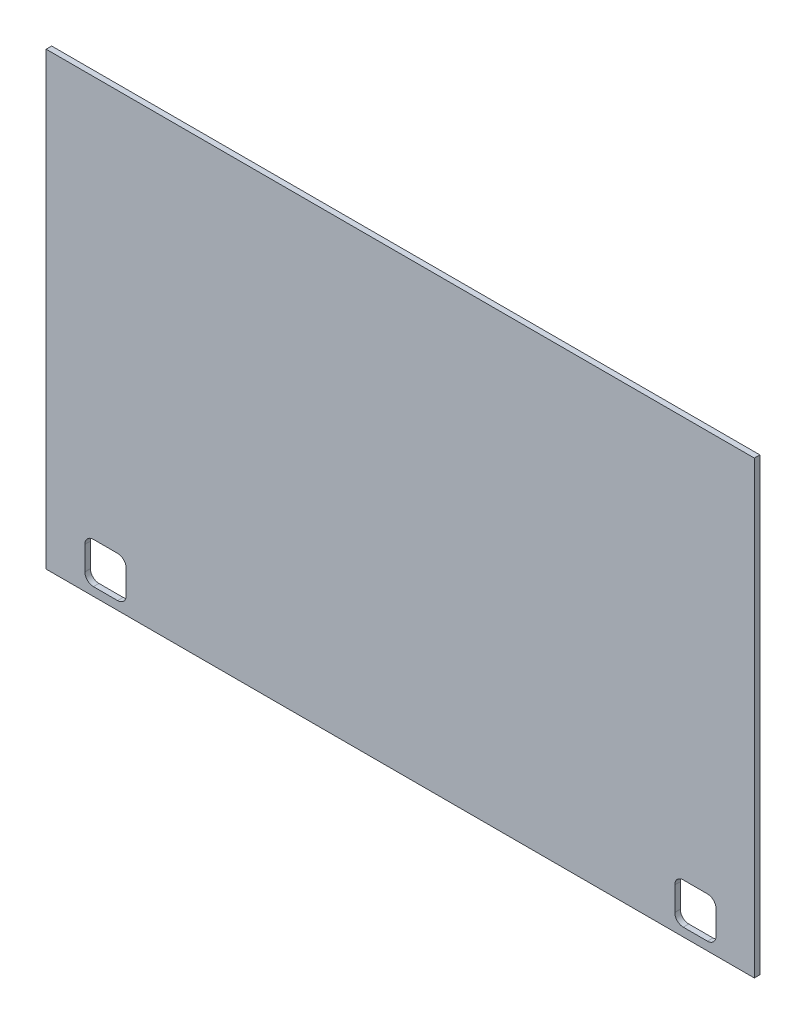
ISO-10303-21;
HEADER;
FILE_DESCRIPTION(('STEP AP214'),'2;1');
FILE_NAME('part.step','',(''),(''),'','','');
FILE_SCHEMA(('AUTOMOTIVE_DESIGN { 1 0 10303 214 1 1 1 1 }'));
ENDSEC;
DATA;
#1=APPLICATION_CONTEXT('core data for automotive mechanical design processes');
#2=APPLICATION_PROTOCOL_DEFINITION('international standard','automotive_design',2000,#1);
#3=PRODUCT_CONTEXT('',#1,'mechanical');
#4=PRODUCT('Part','Part','',(#3));
#5=PRODUCT_RELATED_PRODUCT_CATEGORY('part','',(#4));
#6=PRODUCT_DEFINITION_FORMATION('','',#4);
#7=PRODUCT_DEFINITION_CONTEXT('part definition',#1,'design');
#8=PRODUCT_DEFINITION('design','',#6,#7);
#9=PRODUCT_DEFINITION_SHAPE('','',#8);
#10=(LENGTH_UNIT() NAMED_UNIT(*) SI_UNIT(.MILLI.,.METRE.));
#11=(NAMED_UNIT(*) PLANE_ANGLE_UNIT() SI_UNIT($,.RADIAN.));
#12=(NAMED_UNIT(*) SI_UNIT($,.STERADIAN.) SOLID_ANGLE_UNIT());
#13=UNCERTAINTY_MEASURE_WITH_UNIT(LENGTH_MEASURE(1.E-05),#10,'distance_accuracy_value','');
#14=(GEOMETRIC_REPRESENTATION_CONTEXT(3) GLOBAL_UNCERTAINTY_ASSIGNED_CONTEXT((#13)) GLOBAL_UNIT_ASSIGNED_CONTEXT((#10,
#11,#12)) REPRESENTATION_CONTEXT('',''));
#15=CARTESIAN_POINT('',(0.,0.,0.));
#16=DIRECTION('',(0.,0.,1.));
#17=DIRECTION('',(1.,0.,0.));
#18=AXIS2_PLACEMENT_3D('',#15,#16,#17);
#19=CARTESIAN_POINT('',(416.,-264.5,6.5));
#20=DIRECTION('',(-1.,0.,0.));
#21=DIRECTION('',(0.,0.,1.));
#22=AXIS2_PLACEMENT_3D('',#19,#20,#21);
#23=PLANE('',#22);
#24=DIRECTION('',(0.,1.,0.));
#25=VECTOR('',#24,1.);
#26=CARTESIAN_POINT('',(416.,-264.5,0.));
#27=LINE('',#26,#25);
#28=CARTESIAN_POINT('',(416.,-264.5,0.));
#29=VERTEX_POINT('',#28);
#30=CARTESIAN_POINT('',(416.,264.5,0.));
#31=VERTEX_POINT('',#30);
#32=EDGE_CURVE('E286',#29,#31,#27,.T.);
#33=ORIENTED_EDGE('',*,*,#32,.T.);
#34=DIRECTION('',(0.,0.,-1.));
#35=VECTOR('',#34,1.);
#36=CARTESIAN_POINT('',(416.,264.5,6.5));
#37=LINE('',#36,#35);
#38=CARTESIAN_POINT('',(416.,264.5,6.5));
#39=VERTEX_POINT('',#38);
#40=EDGE_CURVE('E11',#39,#31,#37,.T.);
#41=ORIENTED_EDGE('',*,*,#40,.F.);
#42=DIRECTION('',(0.,1.,0.));
#43=VECTOR('',#42,1.);
#44=CARTESIAN_POINT('',(416.,-264.5,6.5));
#45=LINE('',#44,#43);
#46=CARTESIAN_POINT('',(416.,-264.5,6.5));
#47=VERTEX_POINT('',#46);
#48=EDGE_CURVE('E301',#47,#39,#45,.T.);
#49=ORIENTED_EDGE('',*,*,#48,.F.);
#50=DIRECTION('',(0.,0.,-1.));
#51=VECTOR('',#50,1.);
#52=CARTESIAN_POINT('',(416.,-264.5,6.5));
#53=LINE('',#52,#51);
#54=EDGE_CURVE('E311',#47,#29,#53,.T.);
#55=ORIENTED_EDGE('',*,*,#54,.T.);
#56=EDGE_LOOP('',(#33,#41,#49,#55));
#57=FACE_BOUND('',#56,.T.);
#58=ADVANCED_FACE('F32',(#57),#23,.F.);
#59=CARTESIAN_POINT('',(-416.,264.5,6.5));
#60=DIRECTION('',(0.,-1.,0.));
#61=DIRECTION('',(0.,0.,-1.));
#62=AXIS2_PLACEMENT_3D('',#59,#60,#61);
#63=PLANE('',#62);
#64=DIRECTION('',(-1.,0.,0.));
#65=VECTOR('',#64,1.);
#66=CARTESIAN_POINT('',(-416.,264.5,0.));
#67=LINE('',#66,#65);
#68=CARTESIAN_POINT('',(-416.,264.5,0.));
#69=VERTEX_POINT('',#68);
#70=EDGE_CURVE('E314',#31,#69,#67,.T.);
#71=ORIENTED_EDGE('',*,*,#70,.T.);
#72=DIRECTION('',(0.,0.,-1.));
#73=VECTOR('',#72,1.);
#74=CARTESIAN_POINT('',(-416.,264.5,6.5));
#75=LINE('',#74,#73);
#76=CARTESIAN_POINT('',(-416.,264.5,6.5));
#77=VERTEX_POINT('',#76);
#78=EDGE_CURVE('E39',#77,#69,#75,.T.);
#79=ORIENTED_EDGE('',*,*,#78,.F.);
#80=DIRECTION('',(-1.,0.,0.));
#81=VECTOR('',#80,1.);
#82=CARTESIAN_POINT('',(-416.,264.5,6.5));
#83=LINE('',#82,#81);
#84=EDGE_CURVE('E304',#39,#77,#83,.T.);
#85=ORIENTED_EDGE('',*,*,#84,.F.);
#86=ORIENTED_EDGE('',*,*,#40,.T.);
#87=EDGE_LOOP('',(#71,#79,#85,#86));
#88=FACE_BOUND('',#87,.T.);
#89=ADVANCED_FACE('F343',(#88),#63,.F.);
#90=CARTESIAN_POINT('',(-416.,-264.5,6.5));
#91=DIRECTION('',(1.,0.,0.));
#92=DIRECTION('',(0.,0.,-1.));
#93=AXIS2_PLACEMENT_3D('',#90,#91,#92);
#94=PLANE('',#93);
#95=DIRECTION('',(0.,-1.,0.));
#96=VECTOR('',#95,1.);
#97=CARTESIAN_POINT('',(-416.,-264.5,0.));
#98=LINE('',#97,#96);
#99=CARTESIAN_POINT('',(-416.,-264.5,0.));
#100=VERTEX_POINT('',#99);
#101=EDGE_CURVE('E316',#69,#100,#98,.T.);
#102=ORIENTED_EDGE('',*,*,#101,.T.);
#103=DIRECTION('',(0.,0.,-1.));
#104=VECTOR('',#103,1.);
#105=CARTESIAN_POINT('',(-416.,-264.5,6.5));
#106=LINE('',#105,#104);
#107=CARTESIAN_POINT('',(-416.,-264.5,6.5));
#108=VERTEX_POINT('',#107);
#109=EDGE_CURVE('E321',#108,#100,#106,.T.);
#110=ORIENTED_EDGE('',*,*,#109,.F.);
#111=DIRECTION('',(0.,-1.,0.));
#112=VECTOR('',#111,1.);
#113=CARTESIAN_POINT('',(-416.,-264.5,6.5));
#114=LINE('',#113,#112);
#115=EDGE_CURVE('E307',#77,#108,#114,.T.);
#116=ORIENTED_EDGE('',*,*,#115,.F.);
#117=ORIENTED_EDGE('',*,*,#78,.T.);
#118=EDGE_LOOP('',(#102,#110,#116,#117));
#119=FACE_BOUND('',#118,.T.);
#120=ADVANCED_FACE('F328',(#119),#94,.F.);
#121=CARTESIAN_POINT('',(-416.,-264.5,6.5));
#122=DIRECTION('',(0.,1.,0.));
#123=DIRECTION('',(0.,0.,1.));
#124=AXIS2_PLACEMENT_3D('',#121,#122,#123);
#125=PLANE('',#124);
#126=DIRECTION('',(1.,0.,0.));
#127=VECTOR('',#126,1.);
#128=CARTESIAN_POINT('',(-416.,-264.5,0.));
#129=LINE('',#128,#127);
#130=EDGE_CURVE('E305',#100,#29,#129,.T.);
#131=ORIENTED_EDGE('',*,*,#130,.T.);
#132=ORIENTED_EDGE('',*,*,#54,.F.);
#133=DIRECTION('',(1.,0.,0.));
#134=VECTOR('',#133,1.);
#135=CARTESIAN_POINT('',(-416.,-264.5,6.5));
#136=LINE('',#135,#134);
#137=EDGE_CURVE('E309',#108,#47,#136,.T.);
#138=ORIENTED_EDGE('',*,*,#137,.F.);
#139=ORIENTED_EDGE('',*,*,#109,.T.);
#140=EDGE_LOOP('',(#131,#132,#138,#139));
#141=FACE_BOUND('',#140,.T.);
#142=ADVANCED_FACE('F337',(#141),#125,.F.);
#143=CARTESIAN_POINT('',(0.,0.,6.5));
#144=DIRECTION('',(0.,0.,-1.));
#145=DIRECTION('',(-1.,0.,0.));
#146=AXIS2_PLACEMENT_3D('',#143,#144,#145);
#147=PLANE('',#146);
#148=DIRECTION('',(-1.,0.,0.));
#149=VECTOR('',#148,1.);
#150=CARTESIAN_POINT('',(-332.,-254.521350196704,6.5));
#151=LINE('',#150,#149);
#152=CARTESIAN_POINT('',(-332.,-254.521350196704,6.5));
#153=VERTEX_POINT('',#152);
#154=CARTESIAN_POINT('',(-360.473976839619,-254.521350196704,6.5));
#155=VERTEX_POINT('',#154);
#156=EDGE_CURVE('E176',#153,#155,#151,.T.);
#157=ORIENTED_EDGE('',*,*,#156,.T.);
#158=CARTESIAN_POINT('',(-360.473976839619,-244.521350196704,6.5));
#159=DIRECTION('',(0.,0.,-1.));
#160=DIRECTION('',(1.,0.,0.));
#161=AXIS2_PLACEMENT_3D('',#158,#159,#160);
#162=CIRCLE('',#161,10.);
#163=CARTESIAN_POINT('',(-370.473976839619,-244.521350196704,6.5));
#164=VERTEX_POINT('',#163);
#165=EDGE_CURVE('E170',#155,#164,#162,.T.);
#166=ORIENTED_EDGE('',*,*,#165,.T.);
#167=DIRECTION('',(0.,1.,0.));
#168=VECTOR('',#167,1.);
#169=CARTESIAN_POINT('',(-370.473976839619,-244.521350196704,6.5));
#170=LINE('',#169,#168);
#171=CARTESIAN_POINT('',(-370.473976839619,-216.475228476118,6.5));
#172=VERTEX_POINT('',#171);
#173=EDGE_CURVE('E179',#164,#172,#170,.T.);
#174=ORIENTED_EDGE('',*,*,#173,.T.);
#175=CARTESIAN_POINT('',(-360.473976839619,-216.475228476118,6.5));
#176=DIRECTION('',(0.,0.,-1.));
#177=DIRECTION('',(-1.,0.,0.));
#178=AXIS2_PLACEMENT_3D('',#175,#176,#177);
#179=CIRCLE('',#178,9.99999999999999);
#180=CARTESIAN_POINT('',(-360.473976839619,-206.475228476118,6.5));
#181=VERTEX_POINT('',#180);
#182=EDGE_CURVE('E46',#172,#181,#179,.T.);
#183=ORIENTED_EDGE('',*,*,#182,.T.);
#184=DIRECTION('',(1.,0.,0.));
#185=VECTOR('',#184,1.);
#186=CARTESIAN_POINT('',(-332.,-206.475228476118,6.5));
#187=LINE('',#186,#185);
#188=CARTESIAN_POINT('',(-332.,-206.475228476118,6.5));
#189=VERTEX_POINT('',#188);
#190=EDGE_CURVE('E194',#181,#189,#187,.T.);
#191=ORIENTED_EDGE('',*,*,#190,.T.);
#192=CARTESIAN_POINT('',(-332.,-216.475228476118,6.5));
#193=DIRECTION('',(0.,0.,-1.));
#194=DIRECTION('',(1.,0.,0.));
#195=AXIS2_PLACEMENT_3D('',#192,#193,#194);
#196=CIRCLE('',#195,9.99999999999999);
#197=CARTESIAN_POINT('',(-322.,-216.475228476118,6.5));
#198=VERTEX_POINT('',#197);
#199=EDGE_CURVE('E197',#189,#198,#196,.T.);
#200=ORIENTED_EDGE('',*,*,#199,.T.);
#201=DIRECTION('',(0.,-1.,0.));
#202=VECTOR('',#201,1.);
#203=CARTESIAN_POINT('',(-322.,-244.521350196704,6.5));
#204=LINE('',#203,#202);
#205=CARTESIAN_POINT('',(-322.,-244.521350196704,6.5));
#206=VERTEX_POINT('',#205);
#207=EDGE_CURVE('E200',#198,#206,#204,.T.);
#208=ORIENTED_EDGE('',*,*,#207,.T.);
#209=CARTESIAN_POINT('',(-332.,-244.521350196704,6.5));
#210=DIRECTION('',(0.,0.,-1.));
#211=DIRECTION('',(1.,0.,0.));
#212=AXIS2_PLACEMENT_3D('',#209,#210,#211);
#213=CIRCLE('',#212,10.);
#214=EDGE_CURVE('E203',#206,#153,#213,.T.);
#215=ORIENTED_EDGE('',*,*,#214,.T.);
#216=EDGE_LOOP('',(#157,#166,#174,#183,#191,#200,#208,#215));
#217=FACE_BOUND('',#216,.T.);
#218=DIRECTION('',(-1.,0.,0.));
#219=VECTOR('',#218,1.);
#220=CARTESIAN_POINT('',(361.,-254.521350196704,6.5));
#221=LINE('',#220,#219);
#222=CARTESIAN_POINT('',(361.,-254.521350196704,6.5));
#223=VERTEX_POINT('',#222);
#224=CARTESIAN_POINT('',(332.526023160381,-254.521350196704,6.5));
#225=VERTEX_POINT('',#224);
#226=EDGE_CURVE('E259',#223,#225,#221,.T.);
#227=ORIENTED_EDGE('',*,*,#226,.T.);
#228=CARTESIAN_POINT('',(332.526023160381,-244.521350196704,6.5));
#229=DIRECTION('',(0.,0.,-1.));
#230=DIRECTION('',(1.,0.,0.));
#231=AXIS2_PLACEMENT_3D('',#228,#229,#230);
#232=CIRCLE('',#231,10.);
#233=CARTESIAN_POINT('',(322.526023160381,-244.521350196704,6.5));
#234=VERTEX_POINT('',#233);
#235=EDGE_CURVE('E237',#225,#234,#232,.T.);
#236=ORIENTED_EDGE('',*,*,#235,.T.);
#237=DIRECTION('',(0.,1.,0.));
#238=VECTOR('',#237,1.);
#239=CARTESIAN_POINT('',(322.526023160381,-244.521350196704,6.5));
#240=LINE('',#239,#238);
#241=CARTESIAN_POINT('',(322.526023160381,-216.475228476118,6.5));
#242=VERTEX_POINT('',#241);
#243=EDGE_CURVE('E240',#234,#242,#240,.T.);
#244=ORIENTED_EDGE('',*,*,#243,.T.);
#245=CARTESIAN_POINT('',(332.526023160381,-216.475228476118,6.5));
#246=DIRECTION('',(0.,0.,-1.));
#247=DIRECTION('',(-1.,0.,0.));
#248=AXIS2_PLACEMENT_3D('',#245,#246,#247);
#249=CIRCLE('',#248,9.99999999999999);
#250=CARTESIAN_POINT('',(332.526023160381,-206.475228476118,6.5));
#251=VERTEX_POINT('',#250);
#252=EDGE_CURVE('E244',#242,#251,#249,.T.);
#253=ORIENTED_EDGE('',*,*,#252,.T.);
#254=DIRECTION('',(1.,0.,0.));
#255=VECTOR('',#254,1.);
#256=CARTESIAN_POINT('',(361.,-206.475228476118,6.5));
#257=LINE('',#256,#255);
#258=CARTESIAN_POINT('',(361.,-206.475228476118,6.5));
#259=VERTEX_POINT('',#258);
#260=EDGE_CURVE('E247',#251,#259,#257,.T.);
#261=ORIENTED_EDGE('',*,*,#260,.T.);
#262=CARTESIAN_POINT('',(361.,-216.475228476118,6.5));
#263=DIRECTION('',(0.,0.,-1.));
#264=DIRECTION('',(1.,0.,0.));
#265=AXIS2_PLACEMENT_3D('',#262,#263,#264);
#266=CIRCLE('',#265,9.99999999999999);
#267=CARTESIAN_POINT('',(371.,-216.475228476118,6.5));
#268=VERTEX_POINT('',#267);
#269=EDGE_CURVE('E250',#259,#268,#266,.T.);
#270=ORIENTED_EDGE('',*,*,#269,.T.);
#271=DIRECTION('',(0.,-1.,0.));
#272=VECTOR('',#271,1.);
#273=CARTESIAN_POINT('',(371.,-244.521350196704,6.5));
#274=LINE('',#273,#272);
#275=CARTESIAN_POINT('',(371.,-244.521350196704,6.5));
#276=VERTEX_POINT('',#275);
#277=EDGE_CURVE('E253',#268,#276,#274,.T.);
#278=ORIENTED_EDGE('',*,*,#277,.T.);
#279=CARTESIAN_POINT('',(361.,-244.521350196704,6.5));
#280=DIRECTION('',(0.,0.,-1.));
#281=DIRECTION('',(1.,0.,0.));
#282=AXIS2_PLACEMENT_3D('',#279,#280,#281);
#283=CIRCLE('',#282,10.);
#284=EDGE_CURVE('E256',#276,#223,#283,.T.);
#285=ORIENTED_EDGE('',*,*,#284,.T.);
#286=EDGE_LOOP('',(#227,#236,#244,#253,#261,#270,#278,#285));
#287=FACE_BOUND('',#286,.T.);
#288=ORIENTED_EDGE('',*,*,#48,.T.);
#289=ORIENTED_EDGE('',*,*,#84,.T.);
#290=ORIENTED_EDGE('',*,*,#115,.T.);
#291=ORIENTED_EDGE('',*,*,#137,.T.);
#292=EDGE_LOOP('',(#288,#289,#290,#291));
#293=FACE_BOUND('',#292,.T.);
#294=ADVANCED_FACE('F183',(#217,#287,#293),#147,.F.);
#295=CARTESIAN_POINT('',(0.,0.,0.));
#296=DIRECTION('',(0.,0.,-1.));
#297=DIRECTION('',(-1.,0.,0.));
#298=AXIS2_PLACEMENT_3D('',#295,#296,#297);
#299=PLANE('',#298);
#300=CARTESIAN_POINT('',(-360.473976839619,-244.521350196704,0.));
#301=DIRECTION('',(0.,0.,-1.));
#302=DIRECTION('',(1.,0.,0.));
#303=AXIS2_PLACEMENT_3D('',#300,#301,#302);
#304=CIRCLE('',#303,10.);
#305=CARTESIAN_POINT('',(-360.473976839619,-254.521350196704,0.));
#306=VERTEX_POINT('',#305);
#307=CARTESIAN_POINT('',(-370.473976839619,-244.521350196704,0.));
#308=VERTEX_POINT('',#307);
#309=EDGE_CURVE('E54',#306,#308,#304,.T.);
#310=ORIENTED_EDGE('',*,*,#309,.F.);
#311=DIRECTION('',(-1.,0.,0.));
#312=VECTOR('',#311,1.);
#313=CARTESIAN_POINT('',(-332.,-254.521350196704,0.));
#314=LINE('',#313,#312);
#315=CARTESIAN_POINT('',(-332.,-254.521350196704,0.));
#316=VERTEX_POINT('',#315);
#317=EDGE_CURVE('E187',#316,#306,#314,.T.);
#318=ORIENTED_EDGE('',*,*,#317,.F.);
#319=CARTESIAN_POINT('',(-332.,-244.521350196704,0.));
#320=DIRECTION('',(0.,0.,-1.));
#321=DIRECTION('',(1.,0.,0.));
#322=AXIS2_PLACEMENT_3D('',#319,#320,#321);
#323=CIRCLE('',#322,10.);
#324=CARTESIAN_POINT('',(-322.,-244.521350196704,0.));
#325=VERTEX_POINT('',#324);
#326=EDGE_CURVE('E190',#325,#316,#323,.T.);
#327=ORIENTED_EDGE('',*,*,#326,.F.);
#328=DIRECTION('',(0.,-1.,0.));
#329=VECTOR('',#328,1.);
#330=CARTESIAN_POINT('',(-322.,-244.521350196704,0.));
#331=LINE('',#330,#329);
#332=CARTESIAN_POINT('',(-322.,-216.475228476118,0.));
#333=VERTEX_POINT('',#332);
#334=EDGE_CURVE('E218',#333,#325,#331,.T.);
#335=ORIENTED_EDGE('',*,*,#334,.F.);
#336=CARTESIAN_POINT('',(-332.,-216.475228476118,0.));
#337=DIRECTION('',(0.,0.,-1.));
#338=DIRECTION('',(1.,0.,0.));
#339=AXIS2_PLACEMENT_3D('',#336,#337,#338);
#340=CIRCLE('',#339,9.99999999999999);
#341=CARTESIAN_POINT('',(-332.,-206.475228476118,0.));
#342=VERTEX_POINT('',#341);
#343=EDGE_CURVE('E215',#342,#333,#340,.T.);
#344=ORIENTED_EDGE('',*,*,#343,.F.);
#345=DIRECTION('',(1.,0.,0.));
#346=VECTOR('',#345,1.);
#347=CARTESIAN_POINT('',(-332.,-206.475228476118,0.));
#348=LINE('',#347,#346);
#349=CARTESIAN_POINT('',(-360.473976839619,-206.475228476118,0.));
#350=VERTEX_POINT('',#349);
#351=EDGE_CURVE('E212',#350,#342,#348,.T.);
#352=ORIENTED_EDGE('',*,*,#351,.F.);
#353=CARTESIAN_POINT('',(-360.473976839619,-216.475228476118,0.));
#354=DIRECTION('',(0.,0.,-1.));
#355=DIRECTION('',(-1.,0.,0.));
#356=AXIS2_PLACEMENT_3D('',#353,#354,#355);
#357=CIRCLE('',#356,9.99999999999999);
#358=CARTESIAN_POINT('',(-370.473976839619,-216.475228476118,0.));
#359=VERTEX_POINT('',#358);
#360=EDGE_CURVE('E209',#359,#350,#357,.T.);
#361=ORIENTED_EDGE('',*,*,#360,.F.);
#362=DIRECTION('',(0.,1.,0.));
#363=VECTOR('',#362,1.);
#364=CARTESIAN_POINT('',(-370.473976839619,-244.521350196704,0.));
#365=LINE('',#364,#363);
#366=EDGE_CURVE('E207',#308,#359,#365,.T.);
#367=ORIENTED_EDGE('',*,*,#366,.F.);
#368=EDGE_LOOP('',(#310,#318,#327,#335,#344,#352,#361,#367));
#369=FACE_BOUND('',#368,.T.);
#370=CARTESIAN_POINT('',(332.526023160381,-244.521350196704,0.));
#371=DIRECTION('',(0.,0.,-1.));
#372=DIRECTION('',(1.,0.,0.));
#373=AXIS2_PLACEMENT_3D('',#370,#371,#372);
#374=CIRCLE('',#373,10.);
#375=CARTESIAN_POINT('',(332.526023160381,-254.521350196704,0.));
#376=VERTEX_POINT('',#375);
#377=CARTESIAN_POINT('',(322.526023160381,-244.521350196704,0.));
#378=VERTEX_POINT('',#377);
#379=EDGE_CURVE('E225',#376,#378,#374,.T.);
#380=ORIENTED_EDGE('',*,*,#379,.F.);
#381=DIRECTION('',(-1.,0.,0.));
#382=VECTOR('',#381,1.);
#383=CARTESIAN_POINT('',(361.,-254.521350196704,0.));
#384=LINE('',#383,#382);
#385=CARTESIAN_POINT('',(361.,-254.521350196704,0.));
#386=VERTEX_POINT('',#385);
#387=EDGE_CURVE('E241',#386,#376,#384,.T.);
#388=ORIENTED_EDGE('',*,*,#387,.F.);
#389=CARTESIAN_POINT('',(361.,-244.521350196704,0.));
#390=DIRECTION('',(0.,0.,-1.));
#391=DIRECTION('',(1.,0.,0.));
#392=AXIS2_PLACEMENT_3D('',#389,#390,#391);
#393=CIRCLE('',#392,10.);
#394=CARTESIAN_POINT('',(371.,-244.521350196704,0.));
#395=VERTEX_POINT('',#394);
#396=EDGE_CURVE('E279',#395,#386,#393,.T.);
#397=ORIENTED_EDGE('',*,*,#396,.F.);
#398=DIRECTION('',(0.,-1.,0.));
#399=VECTOR('',#398,1.);
#400=CARTESIAN_POINT('',(371.,-244.521350196704,0.));
#401=LINE('',#400,#399);
#402=CARTESIAN_POINT('',(371.,-216.475228476118,0.));
#403=VERTEX_POINT('',#402);
#404=EDGE_CURVE('E276',#403,#395,#401,.T.);
#405=ORIENTED_EDGE('',*,*,#404,.F.);
#406=CARTESIAN_POINT('',(361.,-216.475228476118,0.));
#407=DIRECTION('',(0.,0.,-1.));
#408=DIRECTION('',(1.,0.,0.));
#409=AXIS2_PLACEMENT_3D('',#406,#407,#408);
#410=CIRCLE('',#409,9.99999999999999);
#411=CARTESIAN_POINT('',(361.,-206.475228476118,0.));
#412=VERTEX_POINT('',#411);
#413=EDGE_CURVE('E273',#412,#403,#410,.T.);
#414=ORIENTED_EDGE('',*,*,#413,.F.);
#415=DIRECTION('',(1.,0.,0.));
#416=VECTOR('',#415,1.);
#417=CARTESIAN_POINT('',(361.,-206.475228476118,0.));
#418=LINE('',#417,#416);
#419=CARTESIAN_POINT('',(332.526023160381,-206.475228476118,0.));
#420=VERTEX_POINT('',#419);
#421=EDGE_CURVE('E270',#420,#412,#418,.T.);
#422=ORIENTED_EDGE('',*,*,#421,.F.);
#423=CARTESIAN_POINT('',(332.526023160381,-216.475228476118,0.));
#424=DIRECTION('',(0.,0.,-1.));
#425=DIRECTION('',(-1.,0.,0.));
#426=AXIS2_PLACEMENT_3D('',#423,#424,#425);
#427=CIRCLE('',#426,9.99999999999999);
#428=CARTESIAN_POINT('',(322.526023160381,-216.475228476118,0.));
#429=VERTEX_POINT('',#428);
#430=EDGE_CURVE('E267',#429,#420,#427,.T.);
#431=ORIENTED_EDGE('',*,*,#430,.F.);
#432=DIRECTION('',(0.,1.,0.));
#433=VECTOR('',#432,1.);
#434=CARTESIAN_POINT('',(322.526023160381,-244.521350196704,0.));
#435=LINE('',#434,#433);
#436=EDGE_CURVE('E264',#378,#429,#435,.T.);
#437=ORIENTED_EDGE('',*,*,#436,.F.);
#438=EDGE_LOOP('',(#380,#388,#397,#405,#414,#422,#431,#437));
#439=FACE_BOUND('',#438,.T.);
#440=ORIENTED_EDGE('',*,*,#32,.F.);
#441=ORIENTED_EDGE('',*,*,#130,.F.);
#442=ORIENTED_EDGE('',*,*,#101,.F.);
#443=ORIENTED_EDGE('',*,*,#70,.F.);
#444=EDGE_LOOP('',(#440,#441,#442,#443));
#445=FACE_BOUND('',#444,.T.);
#446=ADVANCED_FACE('F334',(#369,#439,#445),#299,.T.);
#447=CARTESIAN_POINT('',(332.526023160381,-244.521350196704,6.5));
#448=DIRECTION('',(0.,0.,-1.));
#449=DIRECTION('',(-1.,0.,0.));
#450=AXIS2_PLACEMENT_3D('',#447,#448,#449);
#451=CYLINDRICAL_SURFACE('',#450,10.);
#452=ORIENTED_EDGE('',*,*,#379,.T.);
#453=DIRECTION('',(0.,0.,-1.));
#454=VECTOR('',#453,1.);
#455=CARTESIAN_POINT('',(322.526023160381,-244.521350196704,6.5));
#456=LINE('',#455,#454);
#457=EDGE_CURVE('E262',#234,#378,#456,.T.);
#458=ORIENTED_EDGE('',*,*,#457,.F.);
#459=ORIENTED_EDGE('',*,*,#235,.F.);
#460=DIRECTION('',(0.,0.,-1.));
#461=VECTOR('',#460,1.);
#462=CARTESIAN_POINT('',(332.526023160381,-254.521350196704,6.5));
#463=LINE('',#462,#461);
#464=EDGE_CURVE('E284',#225,#376,#463,.T.);
#465=ORIENTED_EDGE('',*,*,#464,.T.);
#466=EDGE_LOOP('',(#452,#458,#459,#465));
#467=FACE_BOUND('',#466,.T.);
#468=ADVANCED_FACE('F355',(#467),#451,.F.);
#469=CARTESIAN_POINT('',(361.,-254.521350196704,6.5));
#470=DIRECTION('',(0.,-1.,0.));
#471=DIRECTION('',(0.,0.,-1.));
#472=AXIS2_PLACEMENT_3D('',#469,#470,#471);
#473=PLANE('',#472);
#474=ORIENTED_EDGE('',*,*,#387,.T.);
#475=ORIENTED_EDGE('',*,*,#464,.F.);
#476=ORIENTED_EDGE('',*,*,#226,.F.);
#477=DIRECTION('',(0.,0.,-1.));
#478=VECTOR('',#477,1.);
#479=CARTESIAN_POINT('',(361.,-254.521350196704,6.5));
#480=LINE('',#479,#478);
#481=EDGE_CURVE('E287',#223,#386,#480,.T.);
#482=ORIENTED_EDGE('',*,*,#481,.T.);
#483=EDGE_LOOP('',(#474,#475,#476,#482));
#484=FACE_BOUND('',#483,.T.);
#485=ADVANCED_FACE('F361',(#484),#473,.F.);
#486=CARTESIAN_POINT('',(361.,-244.521350196704,6.5));
#487=DIRECTION('',(0.,0.,-1.));
#488=DIRECTION('',(-1.,0.,0.));
#489=AXIS2_PLACEMENT_3D('',#486,#487,#488);
#490=CYLINDRICAL_SURFACE('',#489,10.);
#491=ORIENTED_EDGE('',*,*,#396,.T.);
#492=ORIENTED_EDGE('',*,*,#481,.F.);
#493=ORIENTED_EDGE('',*,*,#284,.F.);
#494=DIRECTION('',(0.,0.,-1.));
#495=VECTOR('',#494,1.);
#496=CARTESIAN_POINT('',(371.,-244.521350196704,6.5));
#497=LINE('',#496,#495);
#498=EDGE_CURVE('E289',#276,#395,#497,.T.);
#499=ORIENTED_EDGE('',*,*,#498,.T.);
#500=EDGE_LOOP('',(#491,#492,#493,#499));
#501=FACE_BOUND('',#500,.T.);
#502=ADVANCED_FACE('F382',(#501),#490,.F.);
#503=CARTESIAN_POINT('',(371.,-244.521350196704,6.5));
#504=DIRECTION('',(1.,0.,0.));
#505=DIRECTION('',(0.,0.,-1.));
#506=AXIS2_PLACEMENT_3D('',#503,#504,#505);
#507=PLANE('',#506);
#508=ORIENTED_EDGE('',*,*,#404,.T.);
#509=ORIENTED_EDGE('',*,*,#498,.F.);
#510=ORIENTED_EDGE('',*,*,#277,.F.);
#511=DIRECTION('',(0.,0.,-1.));
#512=VECTOR('',#511,1.);
#513=CARTESIAN_POINT('',(371.,-216.475228476118,6.5));
#514=LINE('',#513,#512);
#515=EDGE_CURVE('E291',#268,#403,#514,.T.);
#516=ORIENTED_EDGE('',*,*,#515,.T.);
#517=EDGE_LOOP('',(#508,#509,#510,#516));
#518=FACE_BOUND('',#517,.T.);
#519=ADVANCED_FACE('F378',(#518),#507,.F.);
#520=CARTESIAN_POINT('',(361.,-216.475228476118,6.5));
#521=DIRECTION('',(0.,0.,-1.));
#522=DIRECTION('',(-1.,0.,0.));
#523=AXIS2_PLACEMENT_3D('',#520,#521,#522);
#524=CYLINDRICAL_SURFACE('',#523,9.99999999999999);
#525=ORIENTED_EDGE('',*,*,#413,.T.);
#526=ORIENTED_EDGE('',*,*,#515,.F.);
#527=ORIENTED_EDGE('',*,*,#269,.F.);
#528=DIRECTION('',(0.,0.,-1.));
#529=VECTOR('',#528,1.);
#530=CARTESIAN_POINT('',(361.,-206.475228476118,6.5));
#531=LINE('',#530,#529);
#532=EDGE_CURVE('E293',#259,#412,#531,.T.);
#533=ORIENTED_EDGE('',*,*,#532,.T.);
#534=EDGE_LOOP('',(#525,#526,#527,#533));
#535=FACE_BOUND('',#534,.T.);
#536=ADVANCED_FACE('F374',(#535),#524,.F.);
#537=CARTESIAN_POINT('',(361.,-206.475228476118,6.5));
#538=DIRECTION('',(0.,1.,0.));
#539=DIRECTION('',(0.,0.,1.));
#540=AXIS2_PLACEMENT_3D('',#537,#538,#539);
#541=PLANE('',#540);
#542=ORIENTED_EDGE('',*,*,#421,.T.);
#543=ORIENTED_EDGE('',*,*,#532,.F.);
#544=ORIENTED_EDGE('',*,*,#260,.F.);
#545=DIRECTION('',(0.,0.,-1.));
#546=VECTOR('',#545,1.);
#547=CARTESIAN_POINT('',(332.526023160381,-206.475228476118,6.5));
#548=LINE('',#547,#546);
#549=EDGE_CURVE('E295',#251,#420,#548,.T.);
#550=ORIENTED_EDGE('',*,*,#549,.T.);
#551=EDGE_LOOP('',(#542,#543,#544,#550));
#552=FACE_BOUND('',#551,.T.);
#553=ADVANCED_FACE('F370',(#552),#541,.F.);
#554=CARTESIAN_POINT('',(332.526023160381,-216.475228476118,6.5));
#555=DIRECTION('',(0.,0.,-1.));
#556=DIRECTION('',(-1.,0.,0.));
#557=AXIS2_PLACEMENT_3D('',#554,#555,#556);
#558=CYLINDRICAL_SURFACE('',#557,9.99999999999999);
#559=ORIENTED_EDGE('',*,*,#430,.T.);
#560=ORIENTED_EDGE('',*,*,#549,.F.);
#561=ORIENTED_EDGE('',*,*,#252,.F.);
#562=DIRECTION('',(0.,0.,-1.));
#563=VECTOR('',#562,1.);
#564=CARTESIAN_POINT('',(322.526023160381,-216.475228476118,6.5));
#565=LINE('',#564,#563);
#566=EDGE_CURVE('E297',#242,#429,#565,.T.);
#567=ORIENTED_EDGE('',*,*,#566,.T.);
#568=EDGE_LOOP('',(#559,#560,#561,#567));
#569=FACE_BOUND('',#568,.T.);
#570=ADVANCED_FACE('F366',(#569),#558,.F.);
#571=CARTESIAN_POINT('',(322.526023160381,-244.521350196704,6.5));
#572=DIRECTION('',(-1.,0.,0.));
#573=DIRECTION('',(0.,0.,1.));
#574=AXIS2_PLACEMENT_3D('',#571,#572,#573);
#575=PLANE('',#574);
#576=ORIENTED_EDGE('',*,*,#436,.T.);
#577=ORIENTED_EDGE('',*,*,#566,.F.);
#578=ORIENTED_EDGE('',*,*,#243,.F.);
#579=ORIENTED_EDGE('',*,*,#457,.T.);
#580=EDGE_LOOP('',(#576,#577,#578,#579));
#581=FACE_BOUND('',#580,.T.);
#582=ADVANCED_FACE('F363',(#581),#575,.F.);
#583=CARTESIAN_POINT('',(-360.473976839619,-244.521350196704,6.5));
#584=DIRECTION('',(0.,0.,-1.));
#585=DIRECTION('',(-1.,0.,0.));
#586=AXIS2_PLACEMENT_3D('',#583,#584,#585);
#587=CYLINDRICAL_SURFACE('',#586,10.);
#588=ORIENTED_EDGE('',*,*,#309,.T.);
#589=DIRECTION('',(0.,0.,-1.));
#590=VECTOR('',#589,1.);
#591=CARTESIAN_POINT('',(-370.473976839619,-244.521350196704,6.5));
#592=LINE('',#591,#590);
#593=EDGE_CURVE('E166',#164,#308,#592,.T.);
#594=ORIENTED_EDGE('',*,*,#593,.F.);
#595=ORIENTED_EDGE('',*,*,#165,.F.);
#596=DIRECTION('',(0.,0.,-1.));
#597=VECTOR('',#596,1.);
#598=CARTESIAN_POINT('',(-360.473976839619,-254.521350196704,6.5));
#599=LINE('',#598,#597);
#600=EDGE_CURVE('E223',#155,#306,#599,.T.);
#601=ORIENTED_EDGE('',*,*,#600,.T.);
#602=EDGE_LOOP('',(#588,#594,#595,#601));
#603=FACE_BOUND('',#602,.T.);
#604=ADVANCED_FACE('F168',(#603),#587,.F.);
#605=CARTESIAN_POINT('',(-332.,-254.521350196704,6.5));
#606=DIRECTION('',(0.,-1.,0.));
#607=DIRECTION('',(0.,0.,-1.));
#608=AXIS2_PLACEMENT_3D('',#605,#606,#607);
#609=PLANE('',#608);
#610=ORIENTED_EDGE('',*,*,#317,.T.);
#611=ORIENTED_EDGE('',*,*,#600,.F.);
#612=ORIENTED_EDGE('',*,*,#156,.F.);
#613=DIRECTION('',(0.,0.,-1.));
#614=VECTOR('',#613,1.);
#615=CARTESIAN_POINT('',(-332.,-254.521350196704,6.5));
#616=LINE('',#615,#614);
#617=EDGE_CURVE('E226',#153,#316,#616,.T.);
#618=ORIENTED_EDGE('',*,*,#617,.T.);
#619=EDGE_LOOP('',(#610,#611,#612,#618));
#620=FACE_BOUND('',#619,.T.);
#621=ADVANCED_FACE('F392',(#620),#609,.F.);
#622=CARTESIAN_POINT('',(-332.,-244.521350196704,6.5));
#623=DIRECTION('',(0.,0.,-1.));
#624=DIRECTION('',(-1.,0.,0.));
#625=AXIS2_PLACEMENT_3D('',#622,#623,#624);
#626=CYLINDRICAL_SURFACE('',#625,10.);
#627=ORIENTED_EDGE('',*,*,#326,.T.);
#628=ORIENTED_EDGE('',*,*,#617,.F.);
#629=ORIENTED_EDGE('',*,*,#214,.F.);
#630=DIRECTION('',(0.,0.,-1.));
#631=VECTOR('',#630,1.);
#632=CARTESIAN_POINT('',(-322.,-244.521350196704,6.5));
#633=LINE('',#632,#631);
#634=EDGE_CURVE('E228',#206,#325,#633,.T.);
#635=ORIENTED_EDGE('',*,*,#634,.T.);
#636=EDGE_LOOP('',(#627,#628,#629,#635));
#637=FACE_BOUND('',#636,.T.);
#638=ADVANCED_FACE('F409',(#637),#626,.F.);
#639=CARTESIAN_POINT('',(-322.,-244.521350196704,6.5));
#640=DIRECTION('',(1.,0.,0.));
#641=DIRECTION('',(0.,0.,-1.));
#642=AXIS2_PLACEMENT_3D('',#639,#640,#641);
#643=PLANE('',#642);
#644=ORIENTED_EDGE('',*,*,#334,.T.);
#645=ORIENTED_EDGE('',*,*,#634,.F.);
#646=ORIENTED_EDGE('',*,*,#207,.F.);
#647=DIRECTION('',(0.,0.,-1.));
#648=VECTOR('',#647,1.);
#649=CARTESIAN_POINT('',(-322.,-216.475228476118,6.5));
#650=LINE('',#649,#648);
#651=EDGE_CURVE('E230',#198,#333,#650,.T.);
#652=ORIENTED_EDGE('',*,*,#651,.T.);
#653=EDGE_LOOP('',(#644,#645,#646,#652));
#654=FACE_BOUND('',#653,.T.);
#655=ADVANCED_FACE('F405',(#654),#643,.F.);
#656=CARTESIAN_POINT('',(-332.,-216.475228476118,6.5));
#657=DIRECTION('',(0.,0.,-1.));
#658=DIRECTION('',(-1.,0.,0.));
#659=AXIS2_PLACEMENT_3D('',#656,#657,#658);
#660=CYLINDRICAL_SURFACE('',#659,9.99999999999999);
#661=ORIENTED_EDGE('',*,*,#343,.T.);
#662=ORIENTED_EDGE('',*,*,#651,.F.);
#663=ORIENTED_EDGE('',*,*,#199,.F.);
#664=DIRECTION('',(0.,0.,-1.));
#665=VECTOR('',#664,1.);
#666=CARTESIAN_POINT('',(-332.,-206.475228476118,6.5));
#667=LINE('',#666,#665);
#668=EDGE_CURVE('E232',#189,#342,#667,.T.);
#669=ORIENTED_EDGE('',*,*,#668,.T.);
#670=EDGE_LOOP('',(#661,#662,#663,#669));
#671=FACE_BOUND('',#670,.T.);
#672=ADVANCED_FACE('F401',(#671),#660,.F.);
#673=CARTESIAN_POINT('',(-332.,-206.475228476118,6.5));
#674=DIRECTION('',(0.,1.,0.));
#675=DIRECTION('',(0.,0.,1.));
#676=AXIS2_PLACEMENT_3D('',#673,#674,#675);
#677=PLANE('',#676);
#678=ORIENTED_EDGE('',*,*,#351,.T.);
#679=ORIENTED_EDGE('',*,*,#668,.F.);
#680=ORIENTED_EDGE('',*,*,#190,.F.);
#681=DIRECTION('',(0.,0.,-1.));
#682=VECTOR('',#681,1.);
#683=CARTESIAN_POINT('',(-360.473976839619,-206.475228476118,6.5));
#684=LINE('',#683,#682);
#685=EDGE_CURVE('E234',#181,#350,#684,.T.);
#686=ORIENTED_EDGE('',*,*,#685,.T.);
#687=EDGE_LOOP('',(#678,#679,#680,#686));
#688=FACE_BOUND('',#687,.T.);
#689=ADVANCED_FACE('F398',(#688),#677,.F.);
#690=CARTESIAN_POINT('',(-360.473976839619,-216.475228476118,6.5));
#691=DIRECTION('',(0.,0.,-1.));
#692=DIRECTION('',(-1.,0.,0.));
#693=AXIS2_PLACEMENT_3D('',#690,#691,#692);
#694=CYLINDRICAL_SURFACE('',#693,9.99999999999999);
#695=ORIENTED_EDGE('',*,*,#360,.T.);
#696=ORIENTED_EDGE('',*,*,#685,.F.);
#697=ORIENTED_EDGE('',*,*,#182,.F.);
#698=DIRECTION('',(0.,0.,-1.));
#699=VECTOR('',#698,1.);
#700=CARTESIAN_POINT('',(-370.473976839619,-216.475228476118,6.5));
#701=LINE('',#700,#699);
#702=EDGE_CURVE('E175',#172,#359,#701,.T.);
#703=ORIENTED_EDGE('',*,*,#702,.T.);
#704=EDGE_LOOP('',(#695,#696,#697,#703));
#705=FACE_BOUND('',#704,.T.);
#706=ADVANCED_FACE('F395',(#705),#694,.F.);
#707=CARTESIAN_POINT('',(-370.473976839619,-244.521350196704,6.5));
#708=DIRECTION('',(-1.,0.,0.));
#709=DIRECTION('',(0.,0.,1.));
#710=AXIS2_PLACEMENT_3D('',#707,#708,#709);
#711=PLANE('',#710);
#712=ORIENTED_EDGE('',*,*,#366,.T.);
#713=ORIENTED_EDGE('',*,*,#702,.F.);
#714=ORIENTED_EDGE('',*,*,#173,.F.);
#715=ORIENTED_EDGE('',*,*,#593,.T.);
#716=EDGE_LOOP('',(#712,#713,#714,#715));
#717=FACE_BOUND('',#716,.T.);
#718=ADVANCED_FACE('F180',(#717),#711,.F.);
#719=CLOSED_SHELL('',(#58,#89,#120,#142,#294,#446,#468,#485,#502,#519,#536,#553,#570,#582,#604,
#621,#638,#655,#672,#689,#706,#718));
#720=MANIFOLD_SOLID_BREP('B2',#719);
#721=ADVANCED_BREP_SHAPE_REPRESENTATION('',(#18,#720),#14);
#722=SHAPE_DEFINITION_REPRESENTATION(#9,#721);
ENDSEC;
END-ISO-10303-21;
